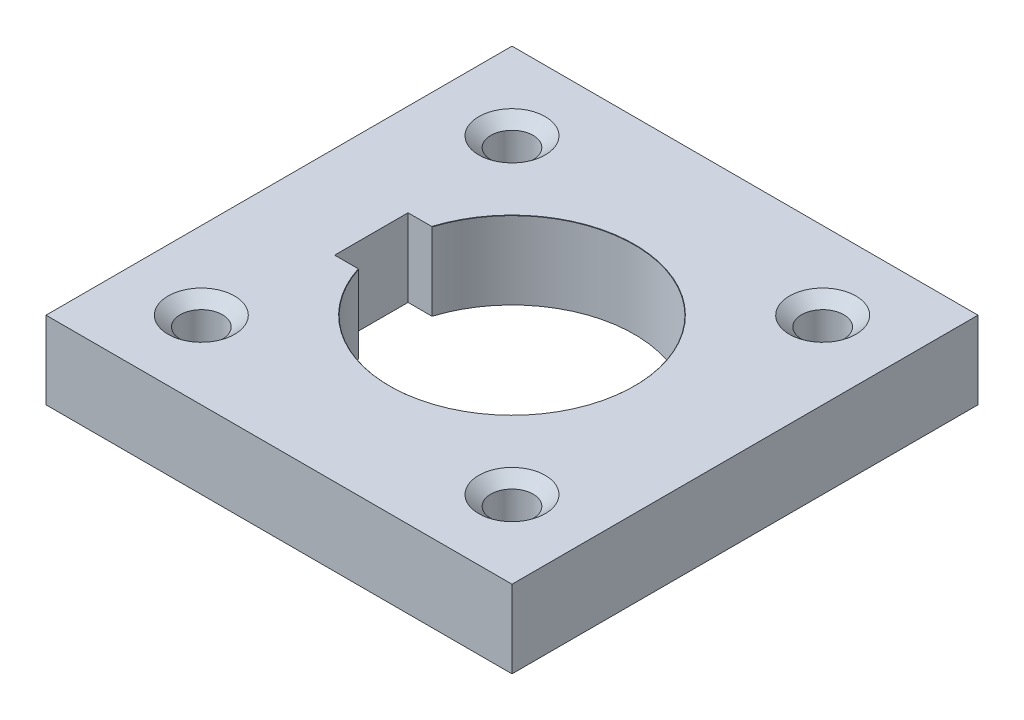
ISO-10303-21;
HEADER;
FILE_DESCRIPTION(('STEP AP214'),'2;1');
FILE_NAME('part.step','',(''),(''),'','','');
FILE_SCHEMA(('AUTOMOTIVE_DESIGN { 1 0 10303 214 1 1 1 1 }'));
ENDSEC;
DATA;
#1=APPLICATION_CONTEXT('core data for automotive mechanical design processes');
#2=APPLICATION_PROTOCOL_DEFINITION('international standard','automotive_design',2000,#1);
#3=PRODUCT_CONTEXT('',#1,'mechanical');
#4=PRODUCT('Part','Part','',(#3));
#5=PRODUCT_RELATED_PRODUCT_CATEGORY('part','',(#4));
#6=PRODUCT_DEFINITION_FORMATION('','',#4);
#7=PRODUCT_DEFINITION_CONTEXT('part definition',#1,'design');
#8=PRODUCT_DEFINITION('design','',#6,#7);
#9=PRODUCT_DEFINITION_SHAPE('','',#8);
#10=(LENGTH_UNIT() NAMED_UNIT(*) SI_UNIT(.MILLI.,.METRE.));
#11=(NAMED_UNIT(*) PLANE_ANGLE_UNIT() SI_UNIT($,.RADIAN.));
#12=(NAMED_UNIT(*) SI_UNIT($,.STERADIAN.) SOLID_ANGLE_UNIT());
#13=UNCERTAINTY_MEASURE_WITH_UNIT(LENGTH_MEASURE(1.E-05),#10,'distance_accuracy_value','');
#14=(GEOMETRIC_REPRESENTATION_CONTEXT(3) GLOBAL_UNCERTAINTY_ASSIGNED_CONTEXT((#13)) GLOBAL_UNIT_ASSIGNED_CONTEXT((#10,
#11,#12)) REPRESENTATION_CONTEXT('',''));
#15=CARTESIAN_POINT('',(0.,0.,0.));
#16=DIRECTION('',(0.,0.,1.));
#17=DIRECTION('',(1.,0.,0.));
#18=AXIS2_PLACEMENT_3D('',#15,#16,#17);
#19=CARTESIAN_POINT('',(0.,6.35,0.));
#20=DIRECTION('',(1.,0.,0.));
#21=DIRECTION('',(0.,0.,-1.));
#22=AXIS2_PLACEMENT_3D('',#19,#20,#21);
#23=PLANE('',#22);
#24=DIRECTION('',(0.,0.,1.));
#25=VECTOR('',#24,1.);
#26=CARTESIAN_POINT('',(0.,0.,0.));
#27=LINE('',#26,#25);
#28=CARTESIAN_POINT('',(0.,0.,-38.1));
#29=VERTEX_POINT('',#28);
#30=CARTESIAN_POINT('',(0.,0.,0.));
#31=VERTEX_POINT('',#30);
#32=EDGE_CURVE('E236',#29,#31,#27,.T.);
#33=ORIENTED_EDGE('',*,*,#32,.T.);
#34=DIRECTION('',(0.,-1.,0.));
#35=VECTOR('',#34,1.);
#36=CARTESIAN_POINT('',(0.,6.35,0.));
#37=LINE('',#36,#35);
#38=CARTESIAN_POINT('',(0.,6.35,0.));
#39=VERTEX_POINT('',#38);
#40=EDGE_CURVE('E268',#39,#31,#37,.T.);
#41=ORIENTED_EDGE('',*,*,#40,.F.);
#42=DIRECTION('',(0.,0.,1.));
#43=VECTOR('',#42,1.);
#44=CARTESIAN_POINT('',(0.,6.35,0.));
#45=LINE('',#44,#43);
#46=CARTESIAN_POINT('',(0.,6.35,-38.1));
#47=VERTEX_POINT('',#46);
#48=EDGE_CURVE('E237',#47,#39,#45,.T.);
#49=ORIENTED_EDGE('',*,*,#48,.F.);
#50=DIRECTION('',(0.,-1.,0.));
#51=VECTOR('',#50,1.);
#52=CARTESIAN_POINT('',(0.,6.35,-38.1));
#53=LINE('',#52,#51);
#54=EDGE_CURVE('E247',#47,#29,#53,.T.);
#55=ORIENTED_EDGE('',*,*,#54,.T.);
#56=EDGE_LOOP('',(#33,#41,#49,#55));
#57=FACE_BOUND('',#56,.T.);
#58=ADVANCED_FACE('F45',(#57),#23,.F.);
#59=CARTESIAN_POINT('',(0.,6.35,0.));
#60=DIRECTION('',(0.,0.,-1.));
#61=DIRECTION('',(-1.,0.,0.));
#62=AXIS2_PLACEMENT_3D('',#59,#60,#61);
#63=PLANE('',#62);
#64=DIRECTION('',(1.,0.,0.));
#65=VECTOR('',#64,1.);
#66=CARTESIAN_POINT('',(0.,0.,0.));
#67=LINE('',#66,#65);
#68=CARTESIAN_POINT('',(38.1,0.,0.));
#69=VERTEX_POINT('',#68);
#70=EDGE_CURVE('E251',#31,#69,#67,.T.);
#71=ORIENTED_EDGE('',*,*,#70,.T.);
#72=DIRECTION('',(0.,-1.,0.));
#73=VECTOR('',#72,1.);
#74=CARTESIAN_POINT('',(38.1,6.35,0.));
#75=LINE('',#74,#73);
#76=CARTESIAN_POINT('',(38.1,6.35,0.));
#77=VERTEX_POINT('',#76);
#78=EDGE_CURVE('E264',#77,#69,#75,.T.);
#79=ORIENTED_EDGE('',*,*,#78,.F.);
#80=DIRECTION('',(1.,0.,0.));
#81=VECTOR('',#80,1.);
#82=CARTESIAN_POINT('',(0.,6.35,0.));
#83=LINE('',#82,#81);
#84=EDGE_CURVE('E104',#39,#77,#83,.T.);
#85=ORIENTED_EDGE('',*,*,#84,.F.);
#86=ORIENTED_EDGE('',*,*,#40,.T.);
#87=EDGE_LOOP('',(#71,#79,#85,#86));
#88=FACE_BOUND('',#87,.T.);
#89=ADVANCED_FACE('F288',(#88),#63,.F.);
#90=CARTESIAN_POINT('',(38.1,6.35,0.));
#91=DIRECTION('',(-1.,0.,0.));
#92=DIRECTION('',(0.,0.,1.));
#93=AXIS2_PLACEMENT_3D('',#90,#91,#92);
#94=PLANE('',#93);
#95=DIRECTION('',(0.,0.,-1.));
#96=VECTOR('',#95,1.);
#97=CARTESIAN_POINT('',(38.1,0.,0.));
#98=LINE('',#97,#96);
#99=CARTESIAN_POINT('',(38.1,0.,-38.1));
#100=VERTEX_POINT('',#99);
#101=EDGE_CURVE('E254',#69,#100,#98,.T.);
#102=ORIENTED_EDGE('',*,*,#101,.T.);
#103=DIRECTION('',(0.,-1.,0.));
#104=VECTOR('',#103,1.);
#105=CARTESIAN_POINT('',(38.1,6.35,-38.1));
#106=LINE('',#105,#104);
#107=CARTESIAN_POINT('',(38.1,6.35,-38.1));
#108=VERTEX_POINT('',#107);
#109=EDGE_CURVE('E261',#108,#100,#106,.T.);
#110=ORIENTED_EDGE('',*,*,#109,.F.);
#111=DIRECTION('',(0.,0.,-1.));
#112=VECTOR('',#111,1.);
#113=CARTESIAN_POINT('',(38.1,6.35,0.));
#114=LINE('',#113,#112);
#115=EDGE_CURVE('E242',#77,#108,#114,.T.);
#116=ORIENTED_EDGE('',*,*,#115,.F.);
#117=ORIENTED_EDGE('',*,*,#78,.T.);
#118=EDGE_LOOP('',(#102,#110,#116,#117));
#119=FACE_BOUND('',#118,.T.);
#120=ADVANCED_FACE('F293',(#119),#94,.F.);
#121=CARTESIAN_POINT('',(0.,6.35,-38.1));
#122=DIRECTION('',(0.,0.,1.));
#123=DIRECTION('',(1.,0.,0.));
#124=AXIS2_PLACEMENT_3D('',#121,#122,#123);
#125=PLANE('',#124);
#126=DIRECTION('',(-1.,0.,0.));
#127=VECTOR('',#126,1.);
#128=CARTESIAN_POINT('',(0.,0.,-38.1));
#129=LINE('',#128,#127);
#130=EDGE_CURVE('E96',#100,#29,#129,.T.);
#131=ORIENTED_EDGE('',*,*,#130,.T.);
#132=ORIENTED_EDGE('',*,*,#54,.F.);
#133=DIRECTION('',(-1.,0.,0.));
#134=VECTOR('',#133,1.);
#135=CARTESIAN_POINT('',(0.,6.35,-38.1));
#136=LINE('',#135,#134);
#137=EDGE_CURVE('E75',#108,#47,#136,.T.);
#138=ORIENTED_EDGE('',*,*,#137,.F.);
#139=ORIENTED_EDGE('',*,*,#109,.T.);
#140=EDGE_LOOP('',(#131,#132,#138,#139));
#141=FACE_BOUND('',#140,.T.);
#142=ADVANCED_FACE('F304',(#141),#125,.F.);
#143=CARTESIAN_POINT('',(0.,6.35,0.));
#144=DIRECTION('',(0.,-1.,0.));
#145=DIRECTION('',(0.,0.,-1.));
#146=AXIS2_PLACEMENT_3D('',#143,#144,#145);
#147=PLANE('',#146);
#148=DIRECTION('',(0.,0.,1.));
#149=VECTOR('',#148,1.);
#150=CARTESIAN_POINT('',(7.55,6.35,-16.05));
#151=LINE('',#150,#149);
#152=CARTESIAN_POINT('',(7.55,6.35,-22.05));
#153=VERTEX_POINT('',#152);
#154=CARTESIAN_POINT('',(7.55,6.35,-16.05));
#155=VERTEX_POINT('',#154);
#156=EDGE_CURVE('E140',#153,#155,#151,.T.);
#157=ORIENTED_EDGE('',*,*,#156,.F.);
#158=DIRECTION('',(-1.,0.,0.));
#159=VECTOR('',#158,1.);
#160=CARTESIAN_POINT('',(7.55,6.35,-22.05));
#161=LINE('',#160,#159);
#162=CARTESIAN_POINT('',(9.48440409592795,6.35,-22.05));
#163=VERTEX_POINT('',#162);
#164=EDGE_CURVE('E158',#163,#153,#161,.T.);
#165=ORIENTED_EDGE('',*,*,#164,.F.);
#166=CARTESIAN_POINT('',(19.05,6.35,-19.05));
#167=DIRECTION('',(0.,1.,0.));
#168=DIRECTION('',(0.,0.,1.));
#169=AXIS2_PLACEMENT_3D('',#166,#167,#168);
#170=CIRCLE('',#169,10.025);
#171=CARTESIAN_POINT('',(9.48440409592795,6.35,-16.05));
#172=VERTEX_POINT('',#171);
#173=EDGE_CURVE('E177',#172,#163,#170,.T.);
#174=ORIENTED_EDGE('',*,*,#173,.F.);
#175=DIRECTION('',(1.,0.,0.));
#176=VECTOR('',#175,1.);
#177=CARTESIAN_POINT('',(7.55,6.35,-16.05));
#178=LINE('',#177,#176);
#179=EDGE_CURVE('E66',#155,#172,#178,.T.);
#180=ORIENTED_EDGE('',*,*,#179,.F.);
#181=EDGE_LOOP('',(#157,#165,#174,#180));
#182=FACE_BOUND('',#181,.T.);
#183=CARTESIAN_POINT('',(31.75,6.35,-31.75));
#184=DIRECTION('',(0.,1.,0.));
#185=DIRECTION('',(0.,0.,1.));
#186=AXIS2_PLACEMENT_3D('',#183,#184,#185);
#187=CIRCLE('',#186,2.7178);
#188=CARTESIAN_POINT('',(31.75,6.35,-29.0322));
#189=VERTEX_POINT('',#188);
#190=EDGE_CURVE('E188',#189,#189,#187,.T.);
#191=ORIENTED_EDGE('',*,*,#190,.F.);
#192=EDGE_LOOP('',(#191));
#193=FACE_BOUND('',#192,.T.);
#194=CARTESIAN_POINT('',(6.35,6.35,-31.75));
#195=DIRECTION('',(0.,1.,0.));
#196=DIRECTION('',(0.,0.,1.));
#197=AXIS2_PLACEMENT_3D('',#194,#195,#196);
#198=CIRCLE('',#197,2.7178);
#199=CARTESIAN_POINT('',(6.35,6.35,-29.0322));
#200=VERTEX_POINT('',#199);
#201=EDGE_CURVE('E200',#200,#200,#198,.T.);
#202=ORIENTED_EDGE('',*,*,#201,.F.);
#203=EDGE_LOOP('',(#202));
#204=FACE_BOUND('',#203,.T.);
#205=CARTESIAN_POINT('',(6.35,6.35,-6.34999999999999));
#206=DIRECTION('',(0.,1.,0.));
#207=DIRECTION('',(0.,0.,1.));
#208=AXIS2_PLACEMENT_3D('',#205,#206,#207);
#209=CIRCLE('',#208,2.7178);
#210=CARTESIAN_POINT('',(6.35,6.35,-3.63219999999999));
#211=VERTEX_POINT('',#210);
#212=EDGE_CURVE('E212',#211,#211,#209,.T.);
#213=ORIENTED_EDGE('',*,*,#212,.F.);
#214=EDGE_LOOP('',(#213));
#215=FACE_BOUND('',#214,.T.);
#216=CARTESIAN_POINT('',(31.75,6.35,-6.35));
#217=DIRECTION('',(0.,1.,0.));
#218=DIRECTION('',(0.,0.,1.));
#219=AXIS2_PLACEMENT_3D('',#216,#217,#218);
#220=CIRCLE('',#219,2.7178);
#221=CARTESIAN_POINT('',(31.75,6.35,-3.6322));
#222=VERTEX_POINT('',#221);
#223=EDGE_CURVE('E224',#222,#222,#220,.T.);
#224=ORIENTED_EDGE('',*,*,#223,.F.);
#225=EDGE_LOOP('',(#224));
#226=FACE_BOUND('',#225,.T.);
#227=ORIENTED_EDGE('',*,*,#48,.T.);
#228=ORIENTED_EDGE('',*,*,#84,.T.);
#229=ORIENTED_EDGE('',*,*,#115,.T.);
#230=ORIENTED_EDGE('',*,*,#137,.T.);
#231=EDGE_LOOP('',(#227,#228,#229,#230));
#232=FACE_BOUND('',#231,.T.);
#233=ADVANCED_FACE('F302',(#182,#193,#204,#215,#226,#232),#147,.F.);
#234=CARTESIAN_POINT('',(0.,0.,0.));
#235=DIRECTION('',(0.,-1.,0.));
#236=DIRECTION('',(0.,0.,-1.));
#237=AXIS2_PLACEMENT_3D('',#234,#235,#236);
#238=PLANE('',#237);
#239=DIRECTION('',(-1.,0.,0.));
#240=VECTOR('',#239,1.);
#241=CARTESIAN_POINT('',(7.55,0.,-22.05));
#242=LINE('',#241,#240);
#243=CARTESIAN_POINT('',(9.51060798583055,0.,-22.05));
#244=VERTEX_POINT('',#243);
#245=CARTESIAN_POINT('',(7.55,0.,-22.05));
#246=VERTEX_POINT('',#245);
#247=EDGE_CURVE('E143',#244,#246,#242,.T.);
#248=ORIENTED_EDGE('',*,*,#247,.T.);
#249=DIRECTION('',(0.,0.,1.));
#250=VECTOR('',#249,1.);
#251=CARTESIAN_POINT('',(7.55,0.,-16.05));
#252=LINE('',#251,#250);
#253=CARTESIAN_POINT('',(7.55,0.,-16.05));
#254=VERTEX_POINT('',#253);
#255=EDGE_CURVE('E137',#246,#254,#252,.T.);
#256=ORIENTED_EDGE('',*,*,#255,.T.);
#257=DIRECTION('',(1.,0.,0.));
#258=VECTOR('',#257,1.);
#259=CARTESIAN_POINT('',(7.55,0.,-16.05));
#260=LINE('',#259,#258);
#261=CARTESIAN_POINT('',(9.51060798583055,0.,-16.05));
#262=VERTEX_POINT('',#261);
#263=EDGE_CURVE('E146',#254,#262,#260,.T.);
#264=ORIENTED_EDGE('',*,*,#263,.T.);
#265=CARTESIAN_POINT('',(19.05,0.,-19.05));
#266=DIRECTION('',(0.,1.,0.));
#267=DIRECTION('',(0.,0.,1.));
#268=AXIS2_PLACEMENT_3D('',#265,#266,#267);
#269=CIRCLE('',#268,10.);
#270=EDGE_CURVE('E185',#262,#244,#269,.T.);
#271=ORIENTED_EDGE('',*,*,#270,.T.);
#272=EDGE_LOOP('',(#248,#256,#264,#271));
#273=FACE_BOUND('',#272,.T.);
#274=CARTESIAN_POINT('',(31.75,0.,-31.75));
#275=DIRECTION('',(0.,1.,0.));
#276=DIRECTION('',(0.,0.,1.));
#277=AXIS2_PLACEMENT_3D('',#274,#275,#276);
#278=CIRCLE('',#277,1.7272);
#279=CARTESIAN_POINT('',(31.75,0.,-30.0228));
#280=VERTEX_POINT('',#279);
#281=EDGE_CURVE('E196',#280,#280,#278,.T.);
#282=ORIENTED_EDGE('',*,*,#281,.T.);
#283=EDGE_LOOP('',(#282));
#284=FACE_BOUND('',#283,.T.);
#285=CARTESIAN_POINT('',(6.35,0.,-31.75));
#286=DIRECTION('',(0.,1.,0.));
#287=DIRECTION('',(0.,0.,1.));
#288=AXIS2_PLACEMENT_3D('',#285,#286,#287);
#289=CIRCLE('',#288,1.7272);
#290=CARTESIAN_POINT('',(6.35,0.,-30.0228));
#291=VERTEX_POINT('',#290);
#292=EDGE_CURVE('E208',#291,#291,#289,.T.);
#293=ORIENTED_EDGE('',*,*,#292,.T.);
#294=EDGE_LOOP('',(#293));
#295=FACE_BOUND('',#294,.T.);
#296=CARTESIAN_POINT('',(6.35,0.,-6.34999999999999));
#297=DIRECTION('',(0.,1.,0.));
#298=DIRECTION('',(0.,0.,1.));
#299=AXIS2_PLACEMENT_3D('',#296,#297,#298);
#300=CIRCLE('',#299,1.7272);
#301=CARTESIAN_POINT('',(6.35,0.,-4.6228));
#302=VERTEX_POINT('',#301);
#303=EDGE_CURVE('E220',#302,#302,#300,.T.);
#304=ORIENTED_EDGE('',*,*,#303,.T.);
#305=EDGE_LOOP('',(#304));
#306=FACE_BOUND('',#305,.T.);
#307=CARTESIAN_POINT('',(31.75,0.,-6.35));
#308=DIRECTION('',(0.,1.,0.));
#309=DIRECTION('',(0.,0.,1.));
#310=AXIS2_PLACEMENT_3D('',#307,#308,#309);
#311=CIRCLE('',#310,1.7272);
#312=CARTESIAN_POINT('',(31.75,0.,-4.6228));
#313=VERTEX_POINT('',#312);
#314=EDGE_CURVE('E232',#313,#313,#311,.T.);
#315=ORIENTED_EDGE('',*,*,#314,.T.);
#316=EDGE_LOOP('',(#315));
#317=FACE_BOUND('',#316,.T.);
#318=ORIENTED_EDGE('',*,*,#32,.F.);
#319=ORIENTED_EDGE('',*,*,#130,.F.);
#320=ORIENTED_EDGE('',*,*,#101,.F.);
#321=ORIENTED_EDGE('',*,*,#70,.F.);
#322=EDGE_LOOP('',(#318,#319,#320,#321));
#323=FACE_BOUND('',#322,.T.);
#324=ADVANCED_FACE('F155',(#273,#284,#295,#306,#317,#323),#238,.T.);
#325=CARTESIAN_POINT('',(31.75,6.35,-6.35));
#326=DIRECTION('',(0.,1.,0.));
#327=DIRECTION('',(0.,0.,1.));
#328=AXIS2_PLACEMENT_3D('',#325,#326,#327);
#329=CYLINDRICAL_SURFACE('',#328,1.7272);
#330=ORIENTED_EDGE('',*,*,#314,.F.);
#331=EDGE_LOOP('',(#330));
#332=FACE_BOUND('',#331,.T.);
#333=CARTESIAN_POINT('',(31.75,5.51878790535579,-6.35));
#334=DIRECTION('',(0.,1.,0.));
#335=DIRECTION('',(0.,0.,1.));
#336=AXIS2_PLACEMENT_3D('',#333,#334,#335);
#337=CIRCLE('',#336,1.7272);
#338=CARTESIAN_POINT('',(31.75,5.51878790535579,-4.6228));
#339=VERTEX_POINT('',#338);
#340=EDGE_CURVE('E228',#339,#339,#337,.T.);
#341=ORIENTED_EDGE('',*,*,#340,.T.);
#342=EDGE_LOOP('',(#341));
#343=FACE_BOUND('',#342,.T.);
#344=ADVANCED_FACE('F311',(#332,#343),#329,.F.);
#345=CARTESIAN_POINT('',(31.75,6.35,-6.35));
#346=DIRECTION('',(0.,1.,0.));
#347=DIRECTION('',(0.,0.,1.));
#348=AXIS2_PLACEMENT_3D('',#345,#346,#347);
#349=CONICAL_SURFACE('',#348,2.7178,0.872664625997165);
#350=ORIENTED_EDGE('',*,*,#340,.F.);
#351=EDGE_LOOP('',(#350));
#352=FACE_BOUND('',#351,.T.);
#353=ORIENTED_EDGE('',*,*,#223,.T.);
#354=EDGE_LOOP('',(#353));
#355=FACE_BOUND('',#354,.T.);
#356=ADVANCED_FACE('F339',(#352,#355),#349,.F.);
#357=CARTESIAN_POINT('',(6.35,6.35,-6.34999999999999));
#358=DIRECTION('',(0.,1.,0.));
#359=DIRECTION('',(0.,0.,1.));
#360=AXIS2_PLACEMENT_3D('',#357,#358,#359);
#361=CYLINDRICAL_SURFACE('',#360,1.7272);
#362=ORIENTED_EDGE('',*,*,#303,.F.);
#363=EDGE_LOOP('',(#362));
#364=FACE_BOUND('',#363,.T.);
#365=CARTESIAN_POINT('',(6.35,5.51878790535579,-6.34999999999999));
#366=DIRECTION('',(0.,1.,0.));
#367=DIRECTION('',(0.,0.,1.));
#368=AXIS2_PLACEMENT_3D('',#365,#366,#367);
#369=CIRCLE('',#368,1.7272);
#370=CARTESIAN_POINT('',(6.35,5.51878790535579,-4.6228));
#371=VERTEX_POINT('',#370);
#372=EDGE_CURVE('E216',#371,#371,#369,.T.);
#373=ORIENTED_EDGE('',*,*,#372,.T.);
#374=EDGE_LOOP('',(#373));
#375=FACE_BOUND('',#374,.T.);
#376=ADVANCED_FACE('F351',(#364,#375),#361,.F.);
#377=CARTESIAN_POINT('',(6.35,6.35,-6.34999999999999));
#378=DIRECTION('',(0.,1.,0.));
#379=DIRECTION('',(0.,0.,1.));
#380=AXIS2_PLACEMENT_3D('',#377,#378,#379);
#381=CONICAL_SURFACE('',#380,2.7178,0.872664625997165);
#382=ORIENTED_EDGE('',*,*,#372,.F.);
#383=EDGE_LOOP('',(#382));
#384=FACE_BOUND('',#383,.T.);
#385=ORIENTED_EDGE('',*,*,#212,.T.);
#386=EDGE_LOOP('',(#385));
#387=FACE_BOUND('',#386,.T.);
#388=ADVANCED_FACE('F361',(#384,#387),#381,.F.);
#389=CARTESIAN_POINT('',(6.35,6.35,-31.75));
#390=DIRECTION('',(0.,1.,0.));
#391=DIRECTION('',(0.,0.,1.));
#392=AXIS2_PLACEMENT_3D('',#389,#390,#391);
#393=CYLINDRICAL_SURFACE('',#392,1.7272);
#394=ORIENTED_EDGE('',*,*,#292,.F.);
#395=EDGE_LOOP('',(#394));
#396=FACE_BOUND('',#395,.T.);
#397=CARTESIAN_POINT('',(6.35,5.51878790535579,-31.75));
#398=DIRECTION('',(0.,1.,0.));
#399=DIRECTION('',(0.,0.,1.));
#400=AXIS2_PLACEMENT_3D('',#397,#398,#399);
#401=CIRCLE('',#400,1.7272);
#402=CARTESIAN_POINT('',(6.35,5.51878790535579,-30.0228));
#403=VERTEX_POINT('',#402);
#404=EDGE_CURVE('E204',#403,#403,#401,.T.);
#405=ORIENTED_EDGE('',*,*,#404,.T.);
#406=EDGE_LOOP('',(#405));
#407=FACE_BOUND('',#406,.T.);
#408=ADVANCED_FACE('F373',(#396,#407),#393,.F.);
#409=CARTESIAN_POINT('',(6.35,6.35,-31.75));
#410=DIRECTION('',(0.,1.,0.));
#411=DIRECTION('',(0.,0.,1.));
#412=AXIS2_PLACEMENT_3D('',#409,#410,#411);
#413=CONICAL_SURFACE('',#412,2.7178,0.872664625997165);
#414=ORIENTED_EDGE('',*,*,#404,.F.);
#415=EDGE_LOOP('',(#414));
#416=FACE_BOUND('',#415,.T.);
#417=ORIENTED_EDGE('',*,*,#201,.T.);
#418=EDGE_LOOP('',(#417));
#419=FACE_BOUND('',#418,.T.);
#420=ADVANCED_FACE('F384',(#416,#419),#413,.F.);
#421=CARTESIAN_POINT('',(31.75,6.35,-31.75));
#422=DIRECTION('',(0.,1.,0.));
#423=DIRECTION('',(0.,0.,1.));
#424=AXIS2_PLACEMENT_3D('',#421,#422,#423);
#425=CYLINDRICAL_SURFACE('',#424,1.7272);
#426=ORIENTED_EDGE('',*,*,#281,.F.);
#427=EDGE_LOOP('',(#426));
#428=FACE_BOUND('',#427,.T.);
#429=CARTESIAN_POINT('',(31.75,5.51878790535579,-31.75));
#430=DIRECTION('',(0.,1.,0.));
#431=DIRECTION('',(0.,0.,1.));
#432=AXIS2_PLACEMENT_3D('',#429,#430,#431);
#433=CIRCLE('',#432,1.7272);
#434=CARTESIAN_POINT('',(31.75,5.51878790535579,-30.0228));
#435=VERTEX_POINT('',#434);
#436=EDGE_CURVE('E192',#435,#435,#433,.T.);
#437=ORIENTED_EDGE('',*,*,#436,.T.);
#438=EDGE_LOOP('',(#437));
#439=FACE_BOUND('',#438,.T.);
#440=ADVANCED_FACE('F396',(#428,#439),#425,.F.);
#441=CARTESIAN_POINT('',(31.75,6.35,-31.75));
#442=DIRECTION('',(0.,1.,0.));
#443=DIRECTION('',(0.,0.,1.));
#444=AXIS2_PLACEMENT_3D('',#441,#442,#443);
#445=CONICAL_SURFACE('',#444,2.7178,0.872664625997165);
#446=ORIENTED_EDGE('',*,*,#436,.F.);
#447=EDGE_LOOP('',(#446));
#448=FACE_BOUND('',#447,.T.);
#449=ORIENTED_EDGE('',*,*,#190,.T.);
#450=EDGE_LOOP('',(#449));
#451=FACE_BOUND('',#450,.T.);
#452=ADVANCED_FACE('F407',(#448,#451),#445,.F.);
#453=CARTESIAN_POINT('',(19.05,6.35,-19.05));
#454=DIRECTION('',(0.,1.,0.));
#455=DIRECTION('',(0.,0.,1.));
#456=AXIS2_PLACEMENT_3D('',#453,#454,#455);
#457=CYLINDRICAL_SURFACE('',#456,10.);
#458=CARTESIAN_POINT('',(19.05,6.32902250922057,-19.05));
#459=DIRECTION('',(0.,1.,0.));
#460=DIRECTION('',(0.,0.,1.));
#461=AXIS2_PLACEMENT_3D('',#458,#459,#460);
#462=CIRCLE('',#461,10.);
#463=CARTESIAN_POINT('',(9.51060798583054,6.32902250922057,-16.05));
#464=VERTEX_POINT('',#463);
#465=CARTESIAN_POINT('',(9.51060798583052,6.32902250922058,-22.05));
#466=VERTEX_POINT('',#465);
#467=EDGE_CURVE('E181',#464,#466,#462,.T.);
#468=ORIENTED_EDGE('',*,*,#467,.T.);
#469=DIRECTION('',(0.,1.,0.));
#470=VECTOR('',#469,1.);
#471=CARTESIAN_POINT('',(9.51060798583055,6.35,-22.05));
#472=LINE('',#471,#470);
#473=EDGE_CURVE('E173',#466,#244,#472,.F.);
#474=ORIENTED_EDGE('',*,*,#473,.T.);
#475=ORIENTED_EDGE('',*,*,#270,.F.);
#476=DIRECTION('',(0.,1.,0.));
#477=VECTOR('',#476,1.);
#478=CARTESIAN_POINT('',(9.51060798583055,6.35,-16.05));
#479=LINE('',#478,#477);
#480=EDGE_CURVE('E149',#262,#464,#479,.T.);
#481=ORIENTED_EDGE('',*,*,#480,.T.);
#482=EDGE_LOOP('',(#468,#474,#475,#481));
#483=FACE_BOUND('',#482,.T.);
#484=ADVANCED_FACE('F417',(#483),#457,.F.);
#485=CARTESIAN_POINT('',(19.05,6.35,-19.05));
#486=DIRECTION('',(0.,1.,0.));
#487=DIRECTION('',(0.,0.,1.));
#488=AXIS2_PLACEMENT_3D('',#485,#486,#487);
#489=CONICAL_SURFACE('',#488,10.025,0.872664625997349);
#490=ORIENTED_EDGE('',*,*,#173,.T.);
#491=CARTESIAN_POINT('',(4.49975137538618,10.4039444583801,-22.05));
#492=CARTESIAN_POINT('',(4.95072643230359,10.0333674840551,-22.05));
#493=CARTESIAN_POINT('',(5.4020098422206,9.66316364876307,-22.05));
#494=CARTESIAN_POINT('',(6.30547207439352,8.92390750996369,-22.05));
#495=CARTESIAN_POINT('',(6.75765083964891,8.55485513677479,-22.05));
#496=CARTESIAN_POINT('',(7.66303562905486,7.81842600969898,-22.05));
#497=CARTESIAN_POINT('',(8.11624110345191,7.451048580344,-22.05));
#498=CARTESIAN_POINT('',(9.02441716207121,6.71841510998883,-22.05));
#499=CARTESIAN_POINT('',(9.47938786322061,6.35315921366146,-22.05));
#500=CARTESIAN_POINT('',(10.1639271894152,5.80756679833385,-22.05));
#501=CARTESIAN_POINT('',(10.392533050397,5.62602260724323,-22.05));
#502=CARTESIAN_POINT('',(10.8505474069154,5.26395243771348,-22.05));
#503=CARTESIAN_POINT('',(11.0799558961569,5.08342645131716,-22.05));
#504=CARTESIAN_POINT('',(11.5397447373035,4.7236932235172,-22.05));
#505=CARTESIAN_POINT('',(11.7701249237324,4.54448577079014,-22.05));
#506=CARTESIAN_POINT('',(12.232184308262,4.1877364047158,-22.05));
#507=CARTESIAN_POINT('',(12.463863545262,4.01019454167376,-22.05));
#508=CARTESIAN_POINT('',(12.9290579499192,3.65721847565277,-22.05));
#509=CARTESIAN_POINT('',(13.1625741976996,3.48178569433298,-22.05));
#510=CARTESIAN_POINT('',(13.6318415730952,3.13396298934864,-22.05));
#511=CARTESIAN_POINT('',(13.8675925117286,2.96157281184646,-22.05));
#512=CARTESIAN_POINT('',(14.2236081442345,2.70617241311342,-22.05));
#513=CARTESIAN_POINT('',(14.3427129481919,2.62154579253539,-22.05));
#514=CARTESIAN_POINT('',(14.5818437131234,2.45360910947934,-22.05));
#515=CARTESIAN_POINT('',(14.7018696502876,2.37029901314037,-22.05));
#516=CARTESIAN_POINT('',(14.9430515316459,2.20525241359895,-22.05));
#517=CARTESIAN_POINT('',(15.0642077839895,2.12351635929922,-22.05));
#518=CARTESIAN_POINT('',(15.3078586572505,1.96204244752144,-22.05));
#519=CARTESIAN_POINT('',(15.4303533966561,1.88230476903954,-22.05));
#520=CARTESIAN_POINT('',(15.5536274155909,1.80377388460675,-22.05));
#521=B_SPLINE_CURVE_WITH_KNOTS('',3,(#491,#492,#493,#494,#495,#496,#497,#498,#499,#500,#501,
#502,#503,#504,#505,#506,#507,#508,#509,#510,#511,#512,#513,#514,#515,#516,#517,#518,#519,#520),
.UNSPECIFIED.,.F.,.F.,(4,2,2,2,2,2,2,2,2,2,2,2,2,2,4),(0.,1.75110215920093,3.50209620987366,
5.25230729784155,7.00263636803882,7.87840267585626,8.75416213010442,9.62977802608519,
10.5054202834032,11.3816229651096,12.2577521983179,12.6960699109298,13.1343763316232,
13.5728059555876,14.0112747107067),.UNSPECIFIED.);
#522=EDGE_CURVE('E11',#163,#466,#521,.T.);
#523=ORIENTED_EDGE('',*,*,#522,.T.);
#524=ORIENTED_EDGE('',*,*,#467,.F.);
#525=CARTESIAN_POINT('',(15.5536274155909,1.80377388460675,-16.05));
#526=CARTESIAN_POINT('',(15.4616560878704,1.86235025679794,-16.05));
#527=CARTESIAN_POINT('',(15.3701242786953,1.9216099826242,-16.05));
#528=CARTESIAN_POINT('',(15.1878383629617,2.041305213151,-16.05));
#529=CARTESIAN_POINT('',(15.0970842196439,2.10174066183001,-16.05));
#530=CARTESIAN_POINT('',(14.8258567925935,2.2845100918703,-16.05));
#531=CARTESIAN_POINT('',(14.6463844811531,2.4083290208081,-16.05));
#532=CARTESIAN_POINT('',(14.2895747034801,2.65881963809037,-16.05));
#533=CARTESIAN_POINT('',(14.1122362946969,2.78548999022725,-16.05));
#534=CARTESIAN_POINT('',(13.7591494944327,3.04104400542458,-16.05));
#535=CARTESIAN_POINT('',(13.5834011898555,3.16992778835327,-16.05));
#536=CARTESIAN_POINT('',(13.2332753022691,3.42932510357509,-16.05));
#537=CARTESIAN_POINT('',(13.058896967311,3.55983762270519,-16.05));
#538=CARTESIAN_POINT('',(12.7111624545015,3.82220870303049,-16.05));
#539=CARTESIAN_POINT('',(12.5378062570275,3.95406723825174,-16.05));
#540=CARTESIAN_POINT('',(12.0189186196081,4.35129000949432,-16.05));
#541=CARTESIAN_POINT('',(11.6746193036834,4.61826323683952,-16.05));
#542=CARTESIAN_POINT('',(11.0433310149854,5.11200787690478,-16.05));
#543=CARTESIAN_POINT('',(10.7560103001555,5.33835666548615,-16.05));
#544=CARTESIAN_POINT('',(10.1825701058768,5.79257139027375,-16.05));
#545=CARTESIAN_POINT('',(9.89645062851556,6.02043732911465,-16.05));
#546=CARTESIAN_POINT('',(9.03949053481192,6.70571814188041,-16.05));
#547=CARTESIAN_POINT('',(8.47001662060436,7.16484089944304,-16.05));
#548=CARTESIAN_POINT('',(7.33289264054783,8.08624285165599,-16.05));
#549=CARTESIAN_POINT('',(6.76524435692058,8.54852424080715,-16.05));
#550=CARTESIAN_POINT('',(5.91491719668832,9.24335763190421,-16.05));
#551=CARTESIAN_POINT('',(5.6316630591716,9.47520614240032,-16.05));
#552=CARTESIAN_POINT('',(5.06547907358396,9.93929775165078,-16.05));
#553=CARTESIAN_POINT('',(4.78254922491066,10.1715408496702,-16.05));
#554=CARTESIAN_POINT('',(4.49975137538618,10.4039444583801,-16.05));
#555=B_SPLINE_CURVE_WITH_KNOTS('',3,(#525,#526,#527,#528,#529,#530,#531,#532,#533,#534,#535,
#536,#537,#538,#539,#540,#541,#542,#543,#544,#545,#546,#547,#548,#549,#550,#551,#552,#553,#554),
.UNSPECIFIED.,.F.,.F.,(4,2,2,2,2,2,2,2,2,2,2,2,2,2,4),(0.,0.327114161529373,0.654212774521561,
1.30828868497541,1.96206421919879,2.61587527094906,3.26929809936781,3.92270834248952,
5.22972033311906,6.3270224663435,7.42432650563223,9.61881383210355,11.8150234893361,
12.9131487383742,14.0112719442655),.UNSPECIFIED.);
#556=EDGE_CURVE('E59',#464,#172,#555,.T.);
#557=ORIENTED_EDGE('',*,*,#556,.T.);
#558=EDGE_LOOP('',(#490,#523,#524,#557));
#559=FACE_BOUND('',#558,.T.);
#560=ADVANCED_FACE('F276',(#559),#489,.F.);
#561=CARTESIAN_POINT('',(7.55,0.,-22.05));
#562=DIRECTION('',(0.,0.,-1.));
#563=DIRECTION('',(-1.,0.,0.));
#564=AXIS2_PLACEMENT_3D('',#561,#562,#563);
#565=PLANE('',#564);
#566=ORIENTED_EDGE('',*,*,#522,.F.);
#567=ORIENTED_EDGE('',*,*,#164,.T.);
#568=DIRECTION('',(0.,1.,0.));
#569=VECTOR('',#568,1.);
#570=CARTESIAN_POINT('',(7.55,0.,-22.05));
#571=LINE('',#570,#569);
#572=EDGE_CURVE('E142',#246,#153,#571,.T.);
#573=ORIENTED_EDGE('',*,*,#572,.F.);
#574=ORIENTED_EDGE('',*,*,#247,.F.);
#575=ORIENTED_EDGE('',*,*,#473,.F.);
#576=EDGE_LOOP('',(#566,#567,#573,#574,#575));
#577=FACE_BOUND('',#576,.T.);
#578=ADVANCED_FACE('F282',(#577),#565,.F.);
#579=CARTESIAN_POINT('',(7.55,0.,-16.05));
#580=DIRECTION('',(0.,0.,1.));
#581=DIRECTION('',(1.,0.,0.));
#582=AXIS2_PLACEMENT_3D('',#579,#580,#581);
#583=PLANE('',#582);
#584=ORIENTED_EDGE('',*,*,#263,.F.);
#585=DIRECTION('',(0.,1.,0.));
#586=VECTOR('',#585,1.);
#587=CARTESIAN_POINT('',(7.55,0.,-16.05));
#588=LINE('',#587,#586);
#589=EDGE_CURVE('E132',#254,#155,#588,.T.);
#590=ORIENTED_EDGE('',*,*,#589,.T.);
#591=ORIENTED_EDGE('',*,*,#179,.T.);
#592=ORIENTED_EDGE('',*,*,#556,.F.);
#593=ORIENTED_EDGE('',*,*,#480,.F.);
#594=EDGE_LOOP('',(#584,#590,#591,#592,#593));
#595=FACE_BOUND('',#594,.T.);
#596=ADVANCED_FACE('F147',(#595),#583,.F.);
#597=CARTESIAN_POINT('',(7.55,0.,-16.05));
#598=DIRECTION('',(-1.,0.,0.));
#599=DIRECTION('',(0.,0.,1.));
#600=AXIS2_PLACEMENT_3D('',#597,#598,#599);
#601=PLANE('',#600);
#602=ORIENTED_EDGE('',*,*,#156,.T.);
#603=ORIENTED_EDGE('',*,*,#589,.F.);
#604=ORIENTED_EDGE('',*,*,#255,.F.);
#605=ORIENTED_EDGE('',*,*,#572,.T.);
#606=EDGE_LOOP('',(#602,#603,#604,#605));
#607=FACE_BOUND('',#606,.T.);
#608=ADVANCED_FACE('F134',(#607),#601,.F.);
#609=CLOSED_SHELL('',(#58,#89,#120,#142,#233,#324,#344,#356,#376,#388,#408,#420,#440,#452,#484,
#560,#578,#596,#608));
#610=MANIFOLD_SOLID_BREP('B2',#609);
#611=ADVANCED_BREP_SHAPE_REPRESENTATION('',(#18,#610),#14);
#612=SHAPE_DEFINITION_REPRESENTATION(#9,#611);
ENDSEC;
END-ISO-10303-21;
